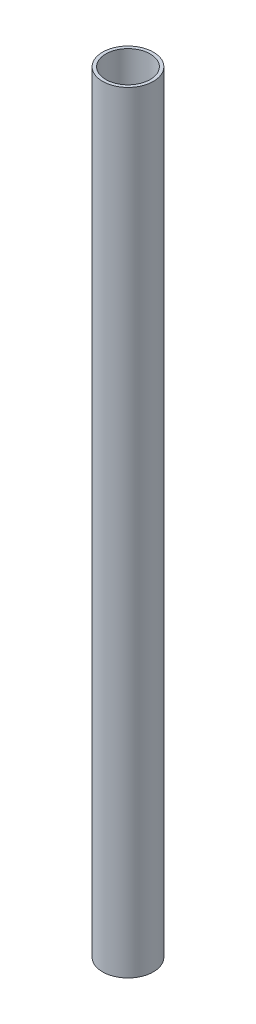
ISO-10303-21;
HEADER;
FILE_DESCRIPTION(('STEP AP214'),'2;1');
FILE_NAME('part.step','',(''),(''),'','','');
FILE_SCHEMA(('AUTOMOTIVE_DESIGN { 1 0 10303 214 1 1 1 1 }'));
ENDSEC;
DATA;
#1=APPLICATION_CONTEXT('core data for automotive mechanical design processes');
#2=APPLICATION_PROTOCOL_DEFINITION('international standard','automotive_design',2000,#1);
#3=PRODUCT_CONTEXT('',#1,'mechanical');
#4=PRODUCT('Part','Part','',(#3));
#5=PRODUCT_RELATED_PRODUCT_CATEGORY('part','',(#4));
#6=PRODUCT_DEFINITION_FORMATION('','',#4);
#7=PRODUCT_DEFINITION_CONTEXT('part definition',#1,'design');
#8=PRODUCT_DEFINITION('design','',#6,#7);
#9=PRODUCT_DEFINITION_SHAPE('','',#8);
#10=(LENGTH_UNIT() NAMED_UNIT(*) SI_UNIT(.MILLI.,.METRE.));
#11=(NAMED_UNIT(*) PLANE_ANGLE_UNIT() SI_UNIT($,.RADIAN.));
#12=(NAMED_UNIT(*) SI_UNIT($,.STERADIAN.) SOLID_ANGLE_UNIT());
#13=UNCERTAINTY_MEASURE_WITH_UNIT(LENGTH_MEASURE(1.E-05),#10,'distance_accuracy_value','');
#14=(GEOMETRIC_REPRESENTATION_CONTEXT(3) GLOBAL_UNCERTAINTY_ASSIGNED_CONTEXT((#13)) GLOBAL_UNIT_ASSIGNED_CONTEXT((#10,
#11,#12)) REPRESENTATION_CONTEXT('',''));
#15=CARTESIAN_POINT('',(0.,0.,0.));
#16=DIRECTION('',(0.,0.,1.));
#17=DIRECTION('',(1.,0.,0.));
#18=AXIS2_PLACEMENT_3D('',#15,#16,#17);
#19=CARTESIAN_POINT('',(0.,243.065,0.));
#20=DIRECTION('',(0.,1.,0.));
#21=DIRECTION('',(0.,0.,1.));
#22=AXIS2_PLACEMENT_3D('',#19,#20,#21);
#23=PLANE('',#22);
#24=CARTESIAN_POINT('',(0.,243.065,0.));
#25=DIRECTION('',(0.,1.,0.));
#26=DIRECTION('',(0.,0.,1.));
#27=AXIS2_PLACEMENT_3D('',#24,#25,#26);
#28=CIRCLE('',#27,8.);
#29=CARTESIAN_POINT('',(0.,243.065,8.));
#30=VERTEX_POINT('',#29);
#31=EDGE_CURVE('E10',#30,#30,#28,.T.);
#32=ORIENTED_EDGE('',*,*,#31,.T.);
#33=EDGE_LOOP('',(#32));
#34=FACE_BOUND('',#33,.T.);
#35=CARTESIAN_POINT('',(0.,243.065,0.));
#36=DIRECTION('',(0.,1.,0.));
#37=DIRECTION('',(0.,0.,1.));
#38=AXIS2_PLACEMENT_3D('',#35,#36,#37);
#39=CIRCLE('',#38,7.);
#40=CARTESIAN_POINT('',(0.,243.065,7.));
#41=VERTEX_POINT('',#40);
#42=EDGE_CURVE('E52',#41,#41,#39,.T.);
#43=ORIENTED_EDGE('',*,*,#42,.F.);
#44=EDGE_LOOP('',(#43));
#45=FACE_BOUND('',#44,.T.);
#46=ADVANCED_FACE('F39',(#34,#45),#23,.T.);
#47=CARTESIAN_POINT('',(0.,0.,0.));
#48=DIRECTION('',(0.,1.,0.));
#49=DIRECTION('',(0.,0.,1.));
#50=AXIS2_PLACEMENT_3D('',#47,#48,#49);
#51=PLANE('',#50);
#52=CARTESIAN_POINT('',(0.,0.,0.));
#53=DIRECTION('',(0.,1.,0.));
#54=DIRECTION('',(0.,0.,1.));
#55=AXIS2_PLACEMENT_3D('',#52,#53,#54);
#56=CIRCLE('',#55,8.);
#57=CARTESIAN_POINT('',(0.,0.,8.));
#58=VERTEX_POINT('',#57);
#59=EDGE_CURVE('E43',#58,#58,#56,.T.);
#60=ORIENTED_EDGE('',*,*,#59,.F.);
#61=EDGE_LOOP('',(#60));
#62=FACE_BOUND('',#61,.T.);
#63=CARTESIAN_POINT('',(0.,0.,0.));
#64=DIRECTION('',(0.,1.,0.));
#65=DIRECTION('',(0.,0.,1.));
#66=AXIS2_PLACEMENT_3D('',#63,#64,#65);
#67=CIRCLE('',#66,7.);
#68=CARTESIAN_POINT('',(0.,0.,7.));
#69=VERTEX_POINT('',#68);
#70=EDGE_CURVE('E54',#69,#69,#67,.T.);
#71=ORIENTED_EDGE('',*,*,#70,.T.);
#72=EDGE_LOOP('',(#71));
#73=FACE_BOUND('',#72,.T.);
#74=ADVANCED_FACE('F66',(#62,#73),#51,.F.);
#75=CARTESIAN_POINT('',(0.,243.065,0.));
#76=DIRECTION('',(0.,-1.,0.));
#77=DIRECTION('',(0.,0.,-1.));
#78=AXIS2_PLACEMENT_3D('',#75,#76,#77);
#79=CYLINDRICAL_SURFACE('',#78,8.);
#80=ORIENTED_EDGE('',*,*,#31,.F.);
#81=EDGE_LOOP('',(#80));
#82=FACE_BOUND('',#81,.T.);
#83=ORIENTED_EDGE('',*,*,#59,.T.);
#84=EDGE_LOOP('',(#83));
#85=FACE_BOUND('',#84,.T.);
#86=ADVANCED_FACE('F41',(#82,#85),#79,.T.);
#87=CARTESIAN_POINT('',(0.,243.065,0.));
#88=DIRECTION('',(0.,-1.,0.));
#89=DIRECTION('',(0.,0.,-1.));
#90=AXIS2_PLACEMENT_3D('',#87,#88,#89);
#91=CYLINDRICAL_SURFACE('',#90,7.);
#92=ORIENTED_EDGE('',*,*,#42,.T.);
#93=EDGE_LOOP('',(#92));
#94=FACE_BOUND('',#93,.T.);
#95=ORIENTED_EDGE('',*,*,#70,.F.);
#96=EDGE_LOOP('',(#95));
#97=FACE_BOUND('',#96,.T.);
#98=ADVANCED_FACE('F62',(#94,#97),#91,.F.);
#99=CLOSED_SHELL('',(#46,#74,#86,#98));
#100=MANIFOLD_SOLID_BREP('B2',#99);
#101=ADVANCED_BREP_SHAPE_REPRESENTATION('',(#18,#100),#14);
#102=SHAPE_DEFINITION_REPRESENTATION(#9,#101);
ENDSEC;
END-ISO-10303-21;
